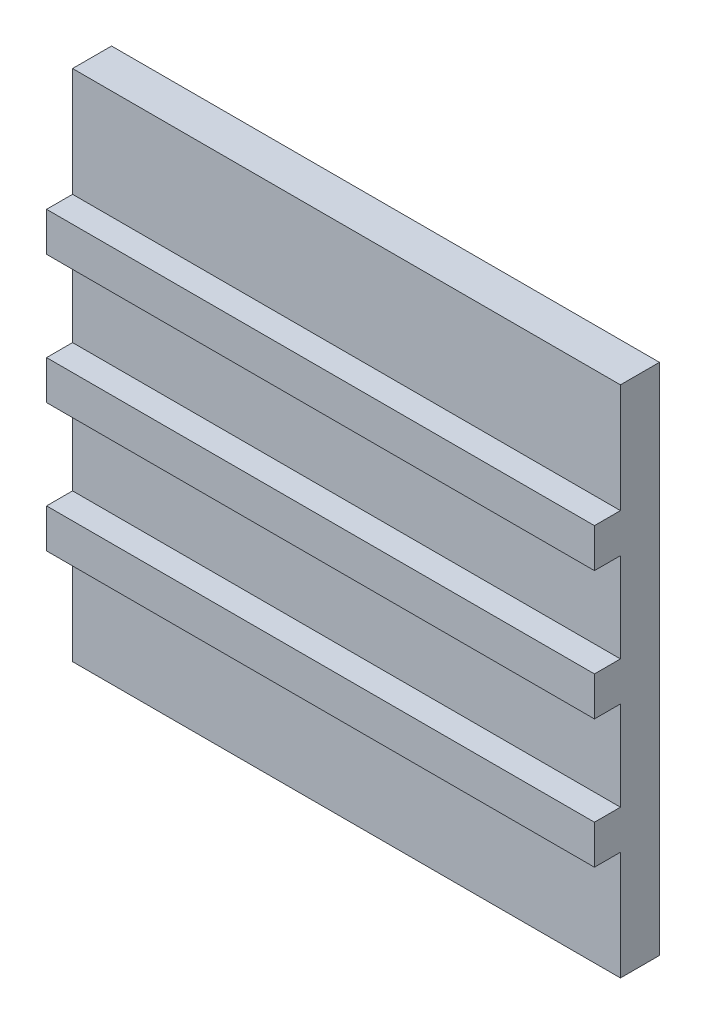
ISO-10303-21;
HEADER;
FILE_DESCRIPTION(('STEP AP214'),'2;1');
FILE_NAME('part.step','',(''),(''),'','','');
FILE_SCHEMA(('AUTOMOTIVE_DESIGN { 1 0 10303 214 1 1 1 1 }'));
ENDSEC;
DATA;
#1=APPLICATION_CONTEXT('core data for automotive mechanical design processes');
#2=APPLICATION_PROTOCOL_DEFINITION('international standard','automotive_design',2000,#1);
#3=PRODUCT_CONTEXT('',#1,'mechanical');
#4=PRODUCT('Part','Part','',(#3));
#5=PRODUCT_RELATED_PRODUCT_CATEGORY('part','',(#4));
#6=PRODUCT_DEFINITION_FORMATION('','',#4);
#7=PRODUCT_DEFINITION_CONTEXT('part definition',#1,'design');
#8=PRODUCT_DEFINITION('design','',#6,#7);
#9=PRODUCT_DEFINITION_SHAPE('','',#8);
#10=(LENGTH_UNIT() NAMED_UNIT(*) SI_UNIT(.MILLI.,.METRE.));
#11=(NAMED_UNIT(*) PLANE_ANGLE_UNIT() SI_UNIT($,.RADIAN.));
#12=(NAMED_UNIT(*) SI_UNIT($,.STERADIAN.) SOLID_ANGLE_UNIT());
#13=UNCERTAINTY_MEASURE_WITH_UNIT(LENGTH_MEASURE(1.E-05),#10,'distance_accuracy_value','');
#14=(GEOMETRIC_REPRESENTATION_CONTEXT(3) GLOBAL_UNCERTAINTY_ASSIGNED_CONTEXT((#13)) GLOBAL_UNIT_ASSIGNED_CONTEXT((#10,
#11,#12)) REPRESENTATION_CONTEXT('',''));
#15=CARTESIAN_POINT('',(0.,0.,0.));
#16=DIRECTION('',(0.,0.,1.));
#17=DIRECTION('',(1.,0.,0.));
#18=AXIS2_PLACEMENT_3D('',#15,#16,#17);
#19=CARTESIAN_POINT('',(0.,0.,3.));
#20=DIRECTION('',(0.,0.,1.));
#21=DIRECTION('',(1.,0.,0.));
#22=AXIS2_PLACEMENT_3D('',#19,#20,#21);
#23=PLANE('',#22);
#24=DIRECTION('',(-1.,0.,0.));
#25=VECTOR('',#24,1.);
#26=CARTESIAN_POINT('',(0.,-10.5501504914669,3.));
#27=LINE('',#26,#25);
#28=CARTESIAN_POINT('',(-9.51645466737487,-10.5501504914669,3.));
#29=VERTEX_POINT('',#28);
#30=CARTESIAN_POINT('',(-51.6664546673749,-10.5501504914669,3.));
#31=VERTEX_POINT('',#30);
#32=EDGE_CURVE('E51',#29,#31,#27,.T.);
#33=ORIENTED_EDGE('',*,*,#32,.T.);
#34=DIRECTION('',(0.,-1.,0.));
#35=VECTOR('',#34,1.);
#36=CARTESIAN_POINT('',(-51.6664546673749,20.5898495085331,3.));
#37=LINE('',#36,#35);
#38=CARTESIAN_POINT('',(-51.6664546673749,-18.9301504914669,3.));
#39=VERTEX_POINT('',#38);
#40=EDGE_CURVE('E243',#31,#39,#37,.T.);
#41=ORIENTED_EDGE('',*,*,#40,.T.);
#42=DIRECTION('',(1.,0.,0.));
#43=VECTOR('',#42,1.);
#44=CARTESIAN_POINT('',(-51.6664546673749,-18.9301504914669,3.));
#45=LINE('',#44,#43);
#46=CARTESIAN_POINT('',(-9.51645466737487,-18.9301504914669,3.));
#47=VERTEX_POINT('',#46);
#48=EDGE_CURVE('E241',#39,#47,#45,.T.);
#49=ORIENTED_EDGE('',*,*,#48,.T.);
#50=DIRECTION('',(0.,1.,0.));
#51=VECTOR('',#50,1.);
#52=CARTESIAN_POINT('',(-9.51645466737488,20.5898495085331,3.));
#53=LINE('',#52,#51);
#54=EDGE_CURVE('E246',#47,#29,#53,.T.);
#55=ORIENTED_EDGE('',*,*,#54,.T.);
#56=EDGE_LOOP('',(#33,#41,#49,#55));
#57=FACE_BOUND('',#56,.T.);
#58=ADVANCED_FACE('F36',(#57),#23,.T.);
#59=CARTESIAN_POINT('',(-51.6664546673749,9.20984950853306,3.));
#60=VERTEX_POINT('',#59);
#61=CARTESIAN_POINT('',(-51.6664546673749,2.32984950853306,3.));
#62=VERTEX_POINT('',#61);
#63=EDGE_CURVE('E242',#60,#62,#37,.T.);
#64=ORIENTED_EDGE('',*,*,#63,.T.);
#65=DIRECTION('',(-1.,0.,0.));
#66=VECTOR('',#65,1.);
#67=CARTESIAN_POINT('',(0.,2.32984950853306,3.));
#68=LINE('',#67,#66);
#69=CARTESIAN_POINT('',(-9.51645466737487,2.32984950853306,3.));
#70=VERTEX_POINT('',#69);
#71=EDGE_CURVE('E158',#70,#62,#68,.T.);
#72=ORIENTED_EDGE('',*,*,#71,.F.);
#73=CARTESIAN_POINT('',(-9.51645466737488,9.20984950853306,3.));
#74=VERTEX_POINT('',#73);
#75=EDGE_CURVE('E287',#70,#74,#53,.T.);
#76=ORIENTED_EDGE('',*,*,#75,.T.);
#77=DIRECTION('',(-1.,0.,0.));
#78=VECTOR('',#77,1.);
#79=CARTESIAN_POINT('',(0.,9.20984950853306,3.));
#80=LINE('',#79,#78);
#81=EDGE_CURVE('E212',#74,#60,#80,.T.);
#82=ORIENTED_EDGE('',*,*,#81,.T.);
#83=EDGE_LOOP('',(#64,#72,#76,#82));
#84=FACE_BOUND('',#83,.T.);
#85=ADVANCED_FACE('F311',(#84),#23,.T.);
#86=DIRECTION('',(1.,0.,0.));
#87=VECTOR('',#86,1.);
#88=CARTESIAN_POINT('',(0.,-7.55015049146694,3.));
#89=LINE('',#88,#87);
#90=CARTESIAN_POINT('',(-51.6664546673749,-7.55015049146694,3.));
#91=VERTEX_POINT('',#90);
#92=CARTESIAN_POINT('',(-9.51645466737487,-7.55015049146694,3.));
#93=VERTEX_POINT('',#92);
#94=EDGE_CURVE('E174',#91,#93,#89,.T.);
#95=ORIENTED_EDGE('',*,*,#94,.T.);
#96=CARTESIAN_POINT('',(-9.51645466737487,-0.670150491466941,3.));
#97=VERTEX_POINT('',#96);
#98=EDGE_CURVE('E249',#93,#97,#53,.T.);
#99=ORIENTED_EDGE('',*,*,#98,.T.);
#100=DIRECTION('',(1.,0.,0.));
#101=VECTOR('',#100,1.);
#102=CARTESIAN_POINT('',(0.,-0.670150491466945,3.));
#103=LINE('',#102,#101);
#104=CARTESIAN_POINT('',(-51.6664546673749,-0.670150491466941,3.));
#105=VERTEX_POINT('',#104);
#106=EDGE_CURVE('E190',#105,#97,#103,.T.);
#107=ORIENTED_EDGE('',*,*,#106,.F.);
#108=EDGE_CURVE('E59',#105,#91,#37,.T.);
#109=ORIENTED_EDGE('',*,*,#108,.T.);
#110=EDGE_LOOP('',(#95,#99,#107,#109));
#111=FACE_BOUND('',#110,.T.);
#112=ADVANCED_FACE('F290',(#111),#23,.T.);
#113=CARTESIAN_POINT('',(-51.6664546673749,20.5898495085331,3.));
#114=VERTEX_POINT('',#113);
#115=CARTESIAN_POINT('',(-51.6664546673749,12.2098495085331,3.));
#116=VERTEX_POINT('',#115);
#117=EDGE_CURVE('E238',#114,#116,#37,.T.);
#118=ORIENTED_EDGE('',*,*,#117,.T.);
#119=DIRECTION('',(1.,0.,0.));
#120=VECTOR('',#119,1.);
#121=CARTESIAN_POINT('',(0.,12.2098495085331,3.));
#122=LINE('',#121,#120);
#123=CARTESIAN_POINT('',(-9.51645466737488,12.2098495085331,3.));
#124=VERTEX_POINT('',#123);
#125=EDGE_CURVE('E217',#116,#124,#122,.T.);
#126=ORIENTED_EDGE('',*,*,#125,.T.);
#127=CARTESIAN_POINT('',(-9.51645466737488,20.5898495085331,3.));
#128=VERTEX_POINT('',#127);
#129=EDGE_CURVE('E245',#124,#128,#53,.T.);
#130=ORIENTED_EDGE('',*,*,#129,.T.);
#131=DIRECTION('',(-1.,0.,0.));
#132=VECTOR('',#131,1.);
#133=CARTESIAN_POINT('',(-51.6664546673749,20.5898495085331,3.));
#134=LINE('',#133,#132);
#135=EDGE_CURVE('E248',#128,#114,#134,.T.);
#136=ORIENTED_EDGE('',*,*,#135,.T.);
#137=EDGE_LOOP('',(#118,#126,#130,#136));
#138=FACE_BOUND('',#137,.T.);
#139=ADVANCED_FACE('F284',(#138),#23,.T.);
#140=CARTESIAN_POINT('',(-51.6664546673749,20.5898495085331,3.));
#141=DIRECTION('',(1.,0.,0.));
#142=DIRECTION('',(0.,0.,-1.));
#143=AXIS2_PLACEMENT_3D('',#140,#141,#142);
#144=PLANE('',#143);
#145=DIRECTION('',(0.,-1.,0.));
#146=VECTOR('',#145,1.);
#147=CARTESIAN_POINT('',(-51.6664546673749,20.5898495085331,0.));
#148=LINE('',#147,#146);
#149=CARTESIAN_POINT('',(-51.6664546673749,20.5898495085331,0.));
#150=VERTEX_POINT('',#149);
#151=CARTESIAN_POINT('',(-51.6664546673749,-18.9301504914669,0.));
#152=VERTEX_POINT('',#151);
#153=EDGE_CURVE('E237',#150,#152,#148,.T.);
#154=ORIENTED_EDGE('',*,*,#153,.T.);
#155=DIRECTION('',(0.,0.,-1.));
#156=VECTOR('',#155,1.);
#157=CARTESIAN_POINT('',(-51.6664546673749,-18.9301504914669,3.));
#158=LINE('',#157,#156);
#159=EDGE_CURVE('E11',#39,#152,#158,.T.);
#160=ORIENTED_EDGE('',*,*,#159,.F.);
#161=ORIENTED_EDGE('',*,*,#40,.F.);
#162=DIRECTION('',(0.,0.,-1.));
#163=VECTOR('',#162,1.);
#164=CARTESIAN_POINT('',(-51.6664546673749,-10.5501504914669,5.));
#165=LINE('',#164,#163);
#166=CARTESIAN_POINT('',(-51.6664546673749,-10.5501504914669,5.));
#167=VERTEX_POINT('',#166);
#168=EDGE_CURVE('E180',#167,#31,#165,.T.);
#169=ORIENTED_EDGE('',*,*,#168,.F.);
#170=DIRECTION('',(0.,-1.,0.));
#171=VECTOR('',#170,1.);
#172=CARTESIAN_POINT('',(-51.6664546673749,0.,5.));
#173=LINE('',#172,#171);
#174=CARTESIAN_POINT('',(-51.6664546673749,-7.55015049146694,5.));
#175=VERTEX_POINT('',#174);
#176=EDGE_CURVE('E172',#175,#167,#173,.T.);
#177=ORIENTED_EDGE('',*,*,#176,.F.);
#178=DIRECTION('',(0.,0.,-1.));
#179=VECTOR('',#178,1.);
#180=CARTESIAN_POINT('',(-51.6664546673749,-7.55015049146694,5.));
#181=LINE('',#180,#179);
#182=EDGE_CURVE('E183',#175,#91,#181,.T.);
#183=ORIENTED_EDGE('',*,*,#182,.T.);
#184=ORIENTED_EDGE('',*,*,#108,.F.);
#185=DIRECTION('',(0.,0.,-1.));
#186=VECTOR('',#185,1.);
#187=CARTESIAN_POINT('',(-51.6664546673749,-0.670150491466943,5.));
#188=LINE('',#187,#186);
#189=CARTESIAN_POINT('',(-51.6664546673749,-0.670150491466943,5.));
#190=VERTEX_POINT('',#189);
#191=EDGE_CURVE('E203',#190,#105,#188,.T.);
#192=ORIENTED_EDGE('',*,*,#191,.F.);
#193=DIRECTION('',(0.,-1.,0.));
#194=VECTOR('',#193,1.);
#195=CARTESIAN_POINT('',(-51.6664546673749,0.,5.));
#196=LINE('',#195,#194);
#197=CARTESIAN_POINT('',(-51.6664546673749,2.32984950853306,5.));
#198=VERTEX_POINT('',#197);
#199=EDGE_CURVE('E192',#198,#190,#196,.T.);
#200=ORIENTED_EDGE('',*,*,#199,.F.);
#201=DIRECTION('',(0.,0.,-1.));
#202=VECTOR('',#201,1.);
#203=CARTESIAN_POINT('',(-51.6664546673749,2.32984950853306,5.));
#204=LINE('',#203,#202);
#205=EDGE_CURVE('E206',#198,#62,#204,.T.);
#206=ORIENTED_EDGE('',*,*,#205,.T.);
#207=ORIENTED_EDGE('',*,*,#63,.F.);
#208=DIRECTION('',(0.,0.,-1.));
#209=VECTOR('',#208,1.);
#210=CARTESIAN_POINT('',(-51.6664546673749,9.20984950853306,5.));
#211=LINE('',#210,#209);
#212=CARTESIAN_POINT('',(-51.6664546673749,9.20984950853306,5.));
#213=VERTEX_POINT('',#212);
#214=EDGE_CURVE('E224',#213,#60,#211,.T.);
#215=ORIENTED_EDGE('',*,*,#214,.F.);
#216=DIRECTION('',(0.,-1.,0.));
#217=VECTOR('',#216,1.);
#218=CARTESIAN_POINT('',(-51.6664546673749,0.,5.));
#219=LINE('',#218,#217);
#220=CARTESIAN_POINT('',(-51.6664546673749,12.2098495085331,5.));
#221=VERTEX_POINT('',#220);
#222=EDGE_CURVE('E222',#221,#213,#219,.T.);
#223=ORIENTED_EDGE('',*,*,#222,.F.);
#224=DIRECTION('',(0.,0.,-1.));
#225=VECTOR('',#224,1.);
#226=CARTESIAN_POINT('',(-51.6664546673749,12.2098495085331,5.));
#227=LINE('',#226,#225);
#228=EDGE_CURVE('E230',#221,#116,#227,.T.);
#229=ORIENTED_EDGE('',*,*,#228,.T.);
#230=ORIENTED_EDGE('',*,*,#117,.F.);
#231=DIRECTION('',(0.,0.,-1.));
#232=VECTOR('',#231,1.);
#233=CARTESIAN_POINT('',(-51.6664546673749,20.5898495085331,3.));
#234=LINE('',#233,#232);
#235=EDGE_CURVE('E251',#114,#150,#234,.T.);
#236=ORIENTED_EDGE('',*,*,#235,.T.);
#237=EDGE_LOOP('',(#154,#160,#161,#169,#177,#183,#184,#192,#200,#206,#207,#215,#223,#229,#230,#236));
#238=FACE_BOUND('',#237,.T.);
#239=ADVANCED_FACE('F38',(#238),#144,.F.);
#240=CARTESIAN_POINT('',(-51.6664546673749,-18.9301504914669,3.));
#241=DIRECTION('',(0.,1.,0.));
#242=DIRECTION('',(0.,0.,1.));
#243=AXIS2_PLACEMENT_3D('',#240,#241,#242);
#244=PLANE('',#243);
#245=DIRECTION('',(1.,0.,0.));
#246=VECTOR('',#245,1.);
#247=CARTESIAN_POINT('',(-51.6664546673749,-18.9301504914669,0.));
#248=LINE('',#247,#246);
#249=CARTESIAN_POINT('',(-9.51645466737487,-18.9301504914669,0.));
#250=VERTEX_POINT('',#249);
#251=EDGE_CURVE('E254',#152,#250,#248,.T.);
#252=ORIENTED_EDGE('',*,*,#251,.T.);
#253=DIRECTION('',(0.,0.,-1.));
#254=VECTOR('',#253,1.);
#255=CARTESIAN_POINT('',(-9.51645466737487,-18.9301504914669,3.));
#256=LINE('',#255,#254);
#257=EDGE_CURVE('E44',#47,#250,#256,.T.);
#258=ORIENTED_EDGE('',*,*,#257,.F.);
#259=ORIENTED_EDGE('',*,*,#48,.F.);
#260=ORIENTED_EDGE('',*,*,#159,.T.);
#261=EDGE_LOOP('',(#252,#258,#259,#260));
#262=FACE_BOUND('',#261,.T.);
#263=ADVANCED_FACE('F303',(#262),#244,.F.);
#264=CARTESIAN_POINT('',(-9.51645466737488,20.5898495085331,3.));
#265=DIRECTION('',(-1.,0.,0.));
#266=DIRECTION('',(0.,-1.,0.));
#267=AXIS2_PLACEMENT_3D('',#264,#265,#266);
#268=PLANE('',#267);
#269=DIRECTION('',(0.,1.,0.));
#270=VECTOR('',#269,1.);
#271=CARTESIAN_POINT('',(-9.51645466737488,20.5898495085331,0.));
#272=LINE('',#271,#270);
#273=CARTESIAN_POINT('',(-9.51645466737488,20.5898495085331,0.));
#274=VERTEX_POINT('',#273);
#275=EDGE_CURVE('E256',#250,#274,#272,.T.);
#276=ORIENTED_EDGE('',*,*,#275,.T.);
#277=DIRECTION('',(0.,0.,-1.));
#278=VECTOR('',#277,1.);
#279=CARTESIAN_POINT('',(-9.51645466737488,20.5898495085331,3.));
#280=LINE('',#279,#278);
#281=EDGE_CURVE('E262',#128,#274,#280,.T.);
#282=ORIENTED_EDGE('',*,*,#281,.F.);
#283=ORIENTED_EDGE('',*,*,#129,.F.);
#284=DIRECTION('',(0.,0.,-1.));
#285=VECTOR('',#284,1.);
#286=CARTESIAN_POINT('',(-9.51645466737488,12.2098495085331,5.));
#287=LINE('',#286,#285);
#288=CARTESIAN_POINT('',(-9.51645466737488,12.2098495085331,5.));
#289=VERTEX_POINT('',#288);
#290=EDGE_CURVE('E232',#289,#124,#287,.T.);
#291=ORIENTED_EDGE('',*,*,#290,.F.);
#292=DIRECTION('',(0.,1.,0.));
#293=VECTOR('',#292,1.);
#294=CARTESIAN_POINT('',(-9.51645466737487,0.,5.));
#295=LINE('',#294,#293);
#296=CARTESIAN_POINT('',(-9.51645466737488,9.20984950853306,5.));
#297=VERTEX_POINT('',#296);
#298=EDGE_CURVE('E216',#297,#289,#295,.T.);
#299=ORIENTED_EDGE('',*,*,#298,.F.);
#300=DIRECTION('',(0.,0.,-1.));
#301=VECTOR('',#300,1.);
#302=CARTESIAN_POINT('',(-9.51645466737488,9.20984950853306,5.));
#303=LINE('',#302,#301);
#304=EDGE_CURVE('E234',#297,#74,#303,.T.);
#305=ORIENTED_EDGE('',*,*,#304,.T.);
#306=ORIENTED_EDGE('',*,*,#75,.F.);
#307=DIRECTION('',(0.,0.,-1.));
#308=VECTOR('',#307,1.);
#309=CARTESIAN_POINT('',(-9.51645466737487,2.32984950853306,5.));
#310=LINE('',#309,#308);
#311=CARTESIAN_POINT('',(-9.51645466737487,2.32984950853306,5.));
#312=VERTEX_POINT('',#311);
#313=EDGE_CURVE('E209',#312,#70,#310,.T.);
#314=ORIENTED_EDGE('',*,*,#313,.F.);
#315=DIRECTION('',(0.,1.,0.));
#316=VECTOR('',#315,1.);
#317=CARTESIAN_POINT('',(-9.51645466737487,0.,5.));
#318=LINE('',#317,#316);
#319=CARTESIAN_POINT('',(-9.51645466737487,-0.670150491466944,5.));
#320=VERTEX_POINT('',#319);
#321=EDGE_CURVE('E186',#320,#312,#318,.T.);
#322=ORIENTED_EDGE('',*,*,#321,.F.);
#323=DIRECTION('',(0.,0.,-1.));
#324=VECTOR('',#323,1.);
#325=CARTESIAN_POINT('',(-9.51645466737487,-0.670150491466944,5.));
#326=LINE('',#325,#324);
#327=EDGE_CURVE('E196',#320,#97,#326,.T.);
#328=ORIENTED_EDGE('',*,*,#327,.T.);
#329=ORIENTED_EDGE('',*,*,#98,.F.);
#330=DIRECTION('',(0.,0.,-1.));
#331=VECTOR('',#330,1.);
#332=CARTESIAN_POINT('',(-9.51645466737487,-7.55015049146694,5.));
#333=LINE('',#332,#331);
#334=CARTESIAN_POINT('',(-9.51645466737487,-7.55015049146694,5.));
#335=VERTEX_POINT('',#334);
#336=EDGE_CURVE('E159',#335,#93,#333,.T.);
#337=ORIENTED_EDGE('',*,*,#336,.F.);
#338=DIRECTION('',(0.,1.,0.));
#339=VECTOR('',#338,1.);
#340=CARTESIAN_POINT('',(-9.51645466737487,0.,5.));
#341=LINE('',#340,#339);
#342=CARTESIAN_POINT('',(-9.51645466737487,-10.5501504914669,5.));
#343=VERTEX_POINT('',#342);
#344=EDGE_CURVE('E162',#343,#335,#341,.T.);
#345=ORIENTED_EDGE('',*,*,#344,.F.);
#346=DIRECTION('',(0.,0.,-1.));
#347=VECTOR('',#346,1.);
#348=CARTESIAN_POINT('',(-9.51645466737487,-10.5501504914669,5.));
#349=LINE('',#348,#347);
#350=EDGE_CURVE('E150',#343,#29,#349,.T.);
#351=ORIENTED_EDGE('',*,*,#350,.T.);
#352=ORIENTED_EDGE('',*,*,#54,.F.);
#353=ORIENTED_EDGE('',*,*,#257,.T.);
#354=EDGE_LOOP('',(#276,#282,#283,#291,#299,#305,#306,#314,#322,#328,#329,#337,#345,#351,#352,#353));
#355=FACE_BOUND('',#354,.T.);
#356=ADVANCED_FACE('F163',(#355),#268,.F.);
#357=CARTESIAN_POINT('',(-51.6664546673749,20.5898495085331,3.));
#358=DIRECTION('',(0.,-1.,0.));
#359=DIRECTION('',(0.,0.,-1.));
#360=AXIS2_PLACEMENT_3D('',#357,#358,#359);
#361=PLANE('',#360);
#362=DIRECTION('',(-1.,0.,0.));
#363=VECTOR('',#362,1.);
#364=CARTESIAN_POINT('',(-51.6664546673749,20.5898495085331,0.));
#365=LINE('',#364,#363);
#366=EDGE_CURVE('E258',#274,#150,#365,.T.);
#367=ORIENTED_EDGE('',*,*,#366,.T.);
#368=ORIENTED_EDGE('',*,*,#235,.F.);
#369=ORIENTED_EDGE('',*,*,#135,.F.);
#370=ORIENTED_EDGE('',*,*,#281,.T.);
#371=EDGE_LOOP('',(#367,#368,#369,#370));
#372=FACE_BOUND('',#371,.T.);
#373=ADVANCED_FACE('F276',(#372),#361,.F.);
#374=CARTESIAN_POINT('',(0.,0.,0.));
#375=DIRECTION('',(0.,0.,1.));
#376=DIRECTION('',(1.,0.,0.));
#377=AXIS2_PLACEMENT_3D('',#374,#375,#376);
#378=PLANE('',#377);
#379=ORIENTED_EDGE('',*,*,#153,.F.);
#380=ORIENTED_EDGE('',*,*,#366,.F.);
#381=ORIENTED_EDGE('',*,*,#275,.F.);
#382=ORIENTED_EDGE('',*,*,#251,.F.);
#383=EDGE_LOOP('',(#379,#380,#381,#382));
#384=FACE_BOUND('',#383,.T.);
#385=ADVANCED_FACE('F273',(#384),#378,.F.);
#386=CARTESIAN_POINT('',(0.,9.20984950853306,5.));
#387=DIRECTION('',(0.,-1.,0.));
#388=DIRECTION('',(1.,0.,0.));
#389=AXIS2_PLACEMENT_3D('',#386,#387,#388);
#390=PLANE('',#389);
#391=ORIENTED_EDGE('',*,*,#81,.F.);
#392=ORIENTED_EDGE('',*,*,#304,.F.);
#393=DIRECTION('',(-1.,0.,0.));
#394=VECTOR('',#393,1.);
#395=CARTESIAN_POINT('',(0.,9.20984950853306,5.));
#396=LINE('',#395,#394);
#397=EDGE_CURVE('E213',#297,#213,#396,.T.);
#398=ORIENTED_EDGE('',*,*,#397,.T.);
#399=ORIENTED_EDGE('',*,*,#214,.T.);
#400=EDGE_LOOP('',(#391,#392,#398,#399));
#401=FACE_BOUND('',#400,.T.);
#402=ADVANCED_FACE('F344',(#401),#390,.T.);
#403=CARTESIAN_POINT('',(0.,12.2098495085331,5.));
#404=DIRECTION('',(0.,1.,0.));
#405=DIRECTION('',(0.,0.,1.));
#406=AXIS2_PLACEMENT_3D('',#403,#404,#405);
#407=PLANE('',#406);
#408=ORIENTED_EDGE('',*,*,#125,.F.);
#409=ORIENTED_EDGE('',*,*,#228,.F.);
#410=DIRECTION('',(1.,0.,0.));
#411=VECTOR('',#410,1.);
#412=CARTESIAN_POINT('',(0.,12.2098495085331,5.));
#413=LINE('',#412,#411);
#414=EDGE_CURVE('E219',#221,#289,#413,.T.);
#415=ORIENTED_EDGE('',*,*,#414,.T.);
#416=ORIENTED_EDGE('',*,*,#290,.T.);
#417=EDGE_LOOP('',(#408,#409,#415,#416));
#418=FACE_BOUND('',#417,.T.);
#419=ADVANCED_FACE('F348',(#418),#407,.T.);
#420=CARTESIAN_POINT('',(0.,0.,5.));
#421=DIRECTION('',(0.,0.,1.));
#422=DIRECTION('',(1.,0.,0.));
#423=AXIS2_PLACEMENT_3D('',#420,#421,#422);
#424=PLANE('',#423);
#425=ORIENTED_EDGE('',*,*,#397,.F.);
#426=ORIENTED_EDGE('',*,*,#298,.T.);
#427=ORIENTED_EDGE('',*,*,#414,.F.);
#428=ORIENTED_EDGE('',*,*,#222,.T.);
#429=EDGE_LOOP('',(#425,#426,#427,#428));
#430=FACE_BOUND('',#429,.T.);
#431=ADVANCED_FACE('F359',(#430),#424,.T.);
#432=CARTESIAN_POINT('',(0.,2.32984950853306,5.));
#433=DIRECTION('',(0.,-1.,0.));
#434=DIRECTION('',(1.,0.,0.));
#435=AXIS2_PLACEMENT_3D('',#432,#433,#434);
#436=PLANE('',#435);
#437=ORIENTED_EDGE('',*,*,#71,.T.);
#438=ORIENTED_EDGE('',*,*,#205,.F.);
#439=DIRECTION('',(-1.,0.,0.));
#440=VECTOR('',#439,1.);
#441=CARTESIAN_POINT('',(0.,2.32984950853306,5.));
#442=LINE('',#441,#440);
#443=EDGE_CURVE('E189',#312,#198,#442,.T.);
#444=ORIENTED_EDGE('',*,*,#443,.F.);
#445=ORIENTED_EDGE('',*,*,#313,.T.);
#446=EDGE_LOOP('',(#437,#438,#444,#445));
#447=FACE_BOUND('',#446,.T.);
#448=ADVANCED_FACE('F371',(#447),#436,.F.);
#449=CARTESIAN_POINT('',(0.,-0.670150491466945,5.));
#450=DIRECTION('',(0.,1.,0.));
#451=DIRECTION('',(-1.,0.,0.));
#452=AXIS2_PLACEMENT_3D('',#449,#450,#451);
#453=PLANE('',#452);
#454=ORIENTED_EDGE('',*,*,#106,.T.);
#455=ORIENTED_EDGE('',*,*,#327,.F.);
#456=DIRECTION('',(1.,0.,0.));
#457=VECTOR('',#456,1.);
#458=CARTESIAN_POINT('',(0.,-0.670150491466945,5.));
#459=LINE('',#458,#457);
#460=EDGE_CURVE('E194',#190,#320,#459,.T.);
#461=ORIENTED_EDGE('',*,*,#460,.F.);
#462=ORIENTED_EDGE('',*,*,#191,.T.);
#463=EDGE_LOOP('',(#454,#455,#461,#462));
#464=FACE_BOUND('',#463,.T.);
#465=ADVANCED_FACE('F294',(#464),#453,.F.);
#466=CARTESIAN_POINT('',(0.,0.,5.));
#467=DIRECTION('',(0.,0.,1.));
#468=DIRECTION('',(1.,0.,0.));
#469=AXIS2_PLACEMENT_3D('',#466,#467,#468);
#470=PLANE('',#469);
#471=ORIENTED_EDGE('',*,*,#321,.T.);
#472=ORIENTED_EDGE('',*,*,#443,.T.);
#473=ORIENTED_EDGE('',*,*,#199,.T.);
#474=ORIENTED_EDGE('',*,*,#460,.T.);
#475=EDGE_LOOP('',(#471,#472,#473,#474));
#476=FACE_BOUND('',#475,.T.);
#477=ADVANCED_FACE('F300',(#476),#470,.T.);
#478=CARTESIAN_POINT('',(0.,-10.5501504914669,5.));
#479=DIRECTION('',(0.,-1.,0.));
#480=DIRECTION('',(1.,0.,0.));
#481=AXIS2_PLACEMENT_3D('',#478,#479,#480);
#482=PLANE('',#481);
#483=ORIENTED_EDGE('',*,*,#32,.F.);
#484=ORIENTED_EDGE('',*,*,#350,.F.);
#485=DIRECTION('',(-1.,0.,0.));
#486=VECTOR('',#485,1.);
#487=CARTESIAN_POINT('',(0.,-10.5501504914669,5.));
#488=LINE('',#487,#486);
#489=EDGE_CURVE('E155',#343,#167,#488,.T.);
#490=ORIENTED_EDGE('',*,*,#489,.T.);
#491=ORIENTED_EDGE('',*,*,#168,.T.);
#492=EDGE_LOOP('',(#483,#484,#490,#491));
#493=FACE_BOUND('',#492,.T.);
#494=ADVANCED_FACE('F152',(#493),#482,.T.);
#495=CARTESIAN_POINT('',(0.,-7.55015049146694,5.));
#496=DIRECTION('',(0.,1.,0.));
#497=DIRECTION('',(0.,0.,1.));
#498=AXIS2_PLACEMENT_3D('',#495,#496,#497);
#499=PLANE('',#498);
#500=ORIENTED_EDGE('',*,*,#94,.F.);
#501=ORIENTED_EDGE('',*,*,#182,.F.);
#502=DIRECTION('',(1.,0.,0.));
#503=VECTOR('',#502,1.);
#504=CARTESIAN_POINT('',(0.,-7.55015049146694,5.));
#505=LINE('',#504,#503);
#506=EDGE_CURVE('E168',#175,#335,#505,.T.);
#507=ORIENTED_EDGE('',*,*,#506,.T.);
#508=ORIENTED_EDGE('',*,*,#336,.T.);
#509=EDGE_LOOP('',(#500,#501,#507,#508));
#510=FACE_BOUND('',#509,.T.);
#511=ADVANCED_FACE('F410',(#510),#499,.T.);
#512=CARTESIAN_POINT('',(0.,0.,5.));
#513=DIRECTION('',(0.,0.,1.));
#514=DIRECTION('',(1.,0.,0.));
#515=AXIS2_PLACEMENT_3D('',#512,#513,#514);
#516=PLANE('',#515);
#517=ORIENTED_EDGE('',*,*,#489,.F.);
#518=ORIENTED_EDGE('',*,*,#344,.T.);
#519=ORIENTED_EDGE('',*,*,#506,.F.);
#520=ORIENTED_EDGE('',*,*,#176,.T.);
#521=EDGE_LOOP('',(#517,#518,#519,#520));
#522=FACE_BOUND('',#521,.T.);
#523=ADVANCED_FACE('F170',(#522),#516,.T.);
#524=CLOSED_SHELL('',(#58,#85,#112,#139,#239,#263,#356,#373,#385,#402,#419,#431,#448,#465,#477,
#494,#511,#523));
#525=MANIFOLD_SOLID_BREP('B2',#524);
#526=ADVANCED_BREP_SHAPE_REPRESENTATION('',(#18,#525),#14);
#527=SHAPE_DEFINITION_REPRESENTATION(#9,#526);
ENDSEC;
END-ISO-10303-21;
